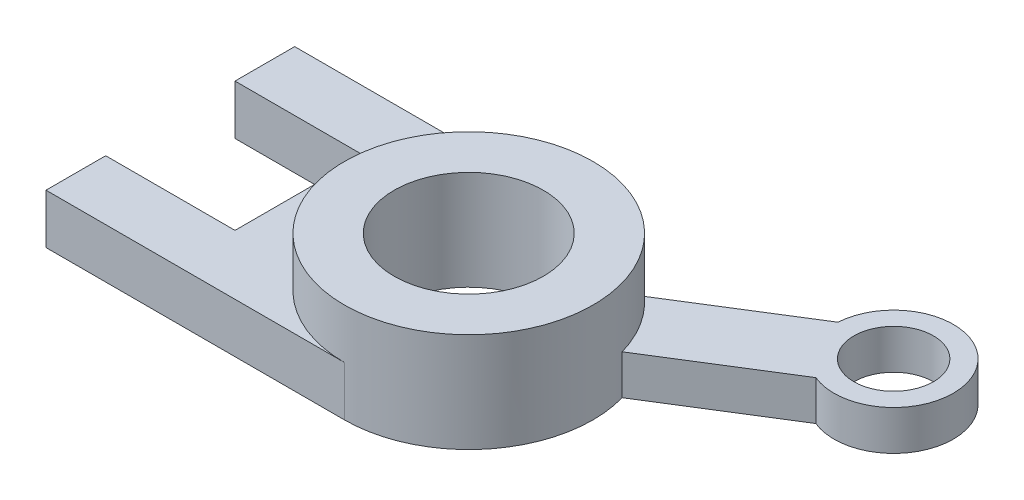
ISO-10303-21;
HEADER;
FILE_DESCRIPTION(('STEP AP214'),'2;1');
FILE_NAME('part.step','',(''),(''),'','','');
FILE_SCHEMA(('AUTOMOTIVE_DESIGN { 1 0 10303 214 1 1 1 1 }'));
ENDSEC;
DATA;
#1=APPLICATION_CONTEXT('core data for automotive mechanical design processes');
#2=APPLICATION_PROTOCOL_DEFINITION('international standard','automotive_design',2000,#1);
#3=PRODUCT_CONTEXT('',#1,'mechanical');
#4=PRODUCT('Part','Part','',(#3));
#5=PRODUCT_RELATED_PRODUCT_CATEGORY('part','',(#4));
#6=PRODUCT_DEFINITION_FORMATION('','',#4);
#7=PRODUCT_DEFINITION_CONTEXT('part definition',#1,'design');
#8=PRODUCT_DEFINITION('design','',#6,#7);
#9=PRODUCT_DEFINITION_SHAPE('','',#8);
#10=(LENGTH_UNIT() NAMED_UNIT(*) SI_UNIT(.MILLI.,.METRE.));
#11=(NAMED_UNIT(*) PLANE_ANGLE_UNIT() SI_UNIT($,.RADIAN.));
#12=(NAMED_UNIT(*) SI_UNIT($,.STERADIAN.) SOLID_ANGLE_UNIT());
#13=UNCERTAINTY_MEASURE_WITH_UNIT(LENGTH_MEASURE(1.E-05),#10,'distance_accuracy_value','');
#14=(GEOMETRIC_REPRESENTATION_CONTEXT(3) GLOBAL_UNCERTAINTY_ASSIGNED_CONTEXT((#13)) GLOBAL_UNIT_ASSIGNED_CONTEXT((#10,
#11,#12)) REPRESENTATION_CONTEXT('',''));
#15=CARTESIAN_POINT('',(0.,0.,0.));
#16=DIRECTION('',(0.,0.,1.));
#17=DIRECTION('',(1.,0.,0.));
#18=AXIS2_PLACEMENT_3D('',#15,#16,#17);
#19=CARTESIAN_POINT('',(0.,10.,0.));
#20=DIRECTION('',(0.,-1.,0.));
#21=DIRECTION('',(0.,0.,-1.));
#22=AXIS2_PLACEMENT_3D('',#19,#20,#21);
#23=CYLINDRICAL_SURFACE('',#22,12.5);
#24=CARTESIAN_POINT('',(0.,10.,0.));
#25=DIRECTION('',(0.,1.,0.));
#26=DIRECTION('',(0.,0.,1.));
#27=AXIS2_PLACEMENT_3D('',#24,#25,#26);
#28=CIRCLE('',#27,12.5);
#29=CARTESIAN_POINT('',(0.,10.,12.5));
#30=VERTEX_POINT('',#29);
#31=EDGE_CURVE('E11',#30,#30,#28,.T.);
#32=ORIENTED_EDGE('',*,*,#31,.F.);
#33=EDGE_LOOP('',(#32));
#34=FACE_BOUND('',#33,.T.);
#35=DIRECTION('',(0.,-1.,0.));
#36=VECTOR('',#35,1.);
#37=CARTESIAN_POINT('',(12.0312945786933,4.,-3.39086283425098));
#38=LINE('',#37,#36);
#39=CARTESIAN_POINT('',(12.0312945786933,4.,-3.39086283425098));
#40=VERTEX_POINT('',#39);
#41=CARTESIAN_POINT('',(12.0312945786933,0.,-3.39086283425098));
#42=VERTEX_POINT('',#41);
#43=EDGE_CURVE('E65',#40,#42,#38,.T.);
#44=ORIENTED_EDGE('',*,*,#43,.F.);
#45=CARTESIAN_POINT('',(0.,4.,0.));
#46=DIRECTION('',(0.,1.,0.));
#47=DIRECTION('',(0.,0.,1.));
#48=AXIS2_PLACEMENT_3D('',#45,#46,#47);
#49=CIRCLE('',#48,12.5);
#50=CARTESIAN_POINT('',(8.32185972906089,4.,-9.32719950734596));
#51=VERTEX_POINT('',#50);
#52=EDGE_CURVE('E60',#40,#51,#49,.T.);
#53=ORIENTED_EDGE('',*,*,#52,.T.);
#54=DIRECTION('',(0.,-1.,0.));
#55=VECTOR('',#54,1.);
#56=CARTESIAN_POINT('',(8.32185972906089,4.,-9.32719950734595));
#57=LINE('',#56,#55);
#58=CARTESIAN_POINT('',(8.32185972906089,0.,-9.32719950734595));
#59=VERTEX_POINT('',#58);
#60=EDGE_CURVE('E160',#51,#59,#57,.T.);
#61=ORIENTED_EDGE('',*,*,#60,.T.);
#62=CARTESIAN_POINT('',(0.,0.,0.));
#63=DIRECTION('',(0.,1.,0.));
#64=DIRECTION('',(0.,0.,1.));
#65=AXIS2_PLACEMENT_3D('',#62,#63,#64);
#66=CIRCLE('',#65,12.5);
#67=CARTESIAN_POINT('',(0.,0.,-12.5));
#68=VERTEX_POINT('',#67);
#69=EDGE_CURVE('E222',#59,#68,#66,.T.);
#70=ORIENTED_EDGE('',*,*,#69,.T.);
#71=DIRECTION('',(0.,-1.,0.));
#72=VECTOR('',#71,1.);
#73=CARTESIAN_POINT('',(0.,5.,-12.5));
#74=LINE('',#73,#72);
#75=CARTESIAN_POINT('',(0.,5.,-12.5));
#76=VERTEX_POINT('',#75);
#77=EDGE_CURVE('E216',#76,#68,#74,.T.);
#78=ORIENTED_EDGE('',*,*,#77,.F.);
#79=CARTESIAN_POINT('',(0.,5.,0.));
#80=DIRECTION('',(0.,1.,0.));
#81=DIRECTION('',(0.,0.,1.));
#82=AXIS2_PLACEMENT_3D('',#79,#80,#81);
#83=CIRCLE('',#82,12.5);
#84=CARTESIAN_POINT('',(0.,5.,12.5));
#85=VERTEX_POINT('',#84);
#86=EDGE_CURVE('E164',#76,#85,#83,.T.);
#87=ORIENTED_EDGE('',*,*,#86,.T.);
#88=DIRECTION('',(0.,-1.,0.));
#89=VECTOR('',#88,1.);
#90=CARTESIAN_POINT('',(0.,5.,12.5));
#91=LINE('',#90,#89);
#92=CARTESIAN_POINT('',(0.,0.,12.5));
#93=VERTEX_POINT('',#92);
#94=EDGE_CURVE('E183',#85,#93,#91,.T.);
#95=ORIENTED_EDGE('',*,*,#94,.T.);
#96=EDGE_CURVE('E47',#93,#42,#66,.T.);
#97=ORIENTED_EDGE('',*,*,#96,.T.);
#98=EDGE_LOOP('',(#44,#53,#61,#70,#78,#87,#95,#97));
#99=FACE_BOUND('',#98,.T.);
#100=ADVANCED_FACE('F43',(#34,#99),#23,.T.);
#101=CARTESIAN_POINT('',(0.,10.,0.));
#102=DIRECTION('',(0.,-1.,0.));
#103=DIRECTION('',(0.,0.,-1.));
#104=AXIS2_PLACEMENT_3D('',#101,#102,#103);
#105=CYLINDRICAL_SURFACE('',#104,7.5);
#106=CARTESIAN_POINT('',(0.,10.,0.));
#107=DIRECTION('',(0.,1.,0.));
#108=DIRECTION('',(0.,0.,1.));
#109=AXIS2_PLACEMENT_3D('',#106,#107,#108);
#110=CIRCLE('',#109,7.5);
#111=CARTESIAN_POINT('',(0.,10.,7.5));
#112=VERTEX_POINT('',#111);
#113=EDGE_CURVE('E52',#112,#112,#110,.T.);
#114=ORIENTED_EDGE('',*,*,#113,.T.);
#115=EDGE_LOOP('',(#114));
#116=FACE_BOUND('',#115,.T.);
#117=CARTESIAN_POINT('',(0.,0.,0.));
#118=DIRECTION('',(0.,1.,0.));
#119=DIRECTION('',(0.,0.,1.));
#120=AXIS2_PLACEMENT_3D('',#117,#118,#119);
#121=CIRCLE('',#120,7.5);
#122=CARTESIAN_POINT('',(0.,0.,7.5));
#123=VERTEX_POINT('',#122);
#124=EDGE_CURVE('E219',#123,#123,#121,.T.);
#125=ORIENTED_EDGE('',*,*,#124,.F.);
#126=EDGE_LOOP('',(#125));
#127=FACE_BOUND('',#126,.T.);
#128=ADVANCED_FACE('F45',(#116,#127),#105,.F.);
#129=CARTESIAN_POINT('',(0.,10.,0.));
#130=DIRECTION('',(0.,1.,0.));
#131=DIRECTION('',(0.,0.,1.));
#132=AXIS2_PLACEMENT_3D('',#129,#130,#131);
#133=PLANE('',#132);
#134=ORIENTED_EDGE('',*,*,#113,.F.);
#135=EDGE_LOOP('',(#134));
#136=FACE_BOUND('',#135,.T.);
#137=ORIENTED_EDGE('',*,*,#31,.T.);
#138=EDGE_LOOP('',(#137));
#139=FACE_BOUND('',#138,.T.);
#140=ADVANCED_FACE('F294',(#136,#139),#133,.T.);
#141=CARTESIAN_POINT('',(0.,0.,0.));
#142=DIRECTION('',(0.,1.,0.));
#143=DIRECTION('',(0.,0.,1.));
#144=AXIS2_PLACEMENT_3D('',#141,#142,#143);
#145=PLANE('',#144);
#146=ORIENTED_EDGE('',*,*,#124,.T.);
#147=EDGE_LOOP('',(#146));
#148=FACE_BOUND('',#147,.T.);
#149=ORIENTED_EDGE('',*,*,#96,.F.);
#150=DIRECTION('',(-1.,0.,0.));
#151=VECTOR('',#150,1.);
#152=CARTESIAN_POINT('',(0.,0.,12.5));
#153=LINE('',#152,#151);
#154=CARTESIAN_POINT('',(-30.,0.,12.5));
#155=VERTEX_POINT('',#154);
#156=EDGE_CURVE('E167',#93,#155,#153,.T.);
#157=ORIENTED_EDGE('',*,*,#156,.T.);
#158=DIRECTION('',(0.,0.,-1.));
#159=VECTOR('',#158,1.);
#160=CARTESIAN_POINT('',(-30.,0.,0.));
#161=LINE('',#160,#159);
#162=CARTESIAN_POINT('',(-30.,0.,6.50000000000001));
#163=VERTEX_POINT('',#162);
#164=EDGE_CURVE('E194',#155,#163,#161,.T.);
#165=ORIENTED_EDGE('',*,*,#164,.T.);
#166=DIRECTION('',(1.,0.,0.));
#167=VECTOR('',#166,1.);
#168=CARTESIAN_POINT('',(0.,0.,6.50000000000001));
#169=LINE('',#168,#167);
#170=CARTESIAN_POINT('',(-17.,0.,6.50000000000001));
#171=VERTEX_POINT('',#170);
#172=EDGE_CURVE('E191',#163,#171,#169,.T.);
#173=ORIENTED_EDGE('',*,*,#172,.T.);
#174=DIRECTION('',(0.,0.,1.));
#175=VECTOR('',#174,1.);
#176=CARTESIAN_POINT('',(-17.,0.,0.));
#177=LINE('',#176,#175);
#178=CARTESIAN_POINT('',(-17.,0.,-6.49999999999999));
#179=VERTEX_POINT('',#178);
#180=EDGE_CURVE('E188',#179,#171,#177,.T.);
#181=ORIENTED_EDGE('',*,*,#180,.F.);
#182=DIRECTION('',(1.,0.,0.));
#183=VECTOR('',#182,1.);
#184=CARTESIAN_POINT('',(0.,0.,-6.49999999999999));
#185=LINE('',#184,#183);
#186=CARTESIAN_POINT('',(-30.,0.,-6.49999999999999));
#187=VERTEX_POINT('',#186);
#188=EDGE_CURVE('E186',#187,#179,#185,.T.);
#189=ORIENTED_EDGE('',*,*,#188,.F.);
#190=DIRECTION('',(0.,0.,1.));
#191=VECTOR('',#190,1.);
#192=CARTESIAN_POINT('',(-30.,0.,0.));
#193=LINE('',#192,#191);
#194=CARTESIAN_POINT('',(-30.,0.,-12.5));
#195=VERTEX_POINT('',#194);
#196=EDGE_CURVE('E158',#195,#187,#193,.T.);
#197=ORIENTED_EDGE('',*,*,#196,.F.);
#198=DIRECTION('',(-1.,0.,0.));
#199=VECTOR('',#198,1.);
#200=CARTESIAN_POINT('',(0.,0.,-12.5));
#201=LINE('',#200,#199);
#202=EDGE_CURVE('E156',#68,#195,#201,.T.);
#203=ORIENTED_EDGE('',*,*,#202,.F.);
#204=ORIENTED_EDGE('',*,*,#69,.F.);
#205=DIRECTION('',(0.848048096156426,0.,-0.529919264233206));
#206=VECTOR('',#205,1.);
#207=CARTESIAN_POINT('',(-1.85471742481622,0.,-2.96816833654749));
#208=LINE('',#207,#206);
#209=CARTESIAN_POINT('',(20.3018983621612,0.,-16.8131584838601));
#210=VERTEX_POINT('',#209);
#211=EDGE_CURVE('E235',#59,#210,#208,.T.);
#212=ORIENTED_EDGE('',*,*,#211,.T.);
#213=CARTESIAN_POINT('',(26.2894909808492,0.,-16.4274971912294));
#214=DIRECTION('',(0.,1.,0.));
#215=DIRECTION('',(0.,0.,1.));
#216=AXIS2_PLACEMENT_3D('',#213,#214,#215);
#217=CIRCLE('',#216,6.);
#218=CARTESIAN_POINT('',(24.0113332117937,0.,-10.8768218107651));
#219=VERTEX_POINT('',#218);
#220=EDGE_CURVE('E233',#219,#210,#217,.T.);
#221=ORIENTED_EDGE('',*,*,#220,.F.);
#222=DIRECTION('',(0.848048096156426,0.,-0.529919264233206));
#223=VECTOR('',#222,1.);
#224=CARTESIAN_POINT('',(1.85471742481622,0.,2.96816833654749));
#225=LINE('',#224,#223);
#226=EDGE_CURVE('E155',#42,#219,#225,.T.);
#227=ORIENTED_EDGE('',*,*,#226,.F.);
#228=EDGE_LOOP('',(#149,#157,#165,#173,#181,#189,#197,#203,#204,#212,#221,#227));
#229=FACE_BOUND('',#228,.T.);
#230=CARTESIAN_POINT('',(26.2894909808492,0.,-16.4274971912294));
#231=DIRECTION('',(0.,1.,0.));
#232=DIRECTION('',(0.,0.,1.));
#233=AXIS2_PLACEMENT_3D('',#230,#231,#232);
#234=CIRCLE('',#233,4.00000000000001);
#235=CARTESIAN_POINT('',(26.2894909808492,0.,-12.4274971912294));
#236=VERTEX_POINT('',#235);
#237=EDGE_CURVE('E151',#236,#236,#234,.T.);
#238=ORIENTED_EDGE('',*,*,#237,.T.);
#239=EDGE_LOOP('',(#238));
#240=FACE_BOUND('',#239,.T.);
#241=ADVANCED_FACE('F230',(#148,#229,#240),#145,.F.);
#242=CARTESIAN_POINT('',(0.,5.,-12.5));
#243=DIRECTION('',(0.,0.,1.));
#244=DIRECTION('',(1.,0.,0.));
#245=AXIS2_PLACEMENT_3D('',#242,#243,#244);
#246=PLANE('',#245);
#247=ORIENTED_EDGE('',*,*,#202,.T.);
#248=DIRECTION('',(0.,-1.,0.));
#249=VECTOR('',#248,1.);
#250=CARTESIAN_POINT('',(-30.,5.,-12.5));
#251=LINE('',#250,#249);
#252=CARTESIAN_POINT('',(-30.,5.,-12.5));
#253=VERTEX_POINT('',#252);
#254=EDGE_CURVE('E213',#253,#195,#251,.T.);
#255=ORIENTED_EDGE('',*,*,#254,.F.);
#256=DIRECTION('',(-1.,0.,0.));
#257=VECTOR('',#256,1.);
#258=CARTESIAN_POINT('',(0.,5.,-12.5));
#259=LINE('',#258,#257);
#260=EDGE_CURVE('E166',#76,#253,#259,.T.);
#261=ORIENTED_EDGE('',*,*,#260,.F.);
#262=ORIENTED_EDGE('',*,*,#77,.T.);
#263=EDGE_LOOP('',(#247,#255,#261,#262));
#264=FACE_BOUND('',#263,.T.);
#265=ADVANCED_FACE('F250',(#264),#246,.F.);
#266=CARTESIAN_POINT('',(-30.,5.,0.));
#267=DIRECTION('',(1.,0.,0.));
#268=DIRECTION('',(0.,0.,-1.));
#269=AXIS2_PLACEMENT_3D('',#266,#267,#268);
#270=PLANE('',#269);
#271=ORIENTED_EDGE('',*,*,#196,.T.);
#272=DIRECTION('',(0.,-1.,0.));
#273=VECTOR('',#272,1.);
#274=CARTESIAN_POINT('',(-30.,5.,-6.49999999999999));
#275=LINE('',#274,#273);
#276=CARTESIAN_POINT('',(-30.,5.,-6.49999999999999));
#277=VERTEX_POINT('',#276);
#278=EDGE_CURVE('E210',#277,#187,#275,.T.);
#279=ORIENTED_EDGE('',*,*,#278,.F.);
#280=DIRECTION('',(0.,0.,1.));
#281=VECTOR('',#280,1.);
#282=CARTESIAN_POINT('',(-30.,5.,0.));
#283=LINE('',#282,#281);
#284=EDGE_CURVE('E169',#253,#277,#283,.T.);
#285=ORIENTED_EDGE('',*,*,#284,.F.);
#286=ORIENTED_EDGE('',*,*,#254,.T.);
#287=EDGE_LOOP('',(#271,#279,#285,#286));
#288=FACE_BOUND('',#287,.T.);
#289=ADVANCED_FACE('F254',(#288),#270,.F.);
#290=CARTESIAN_POINT('',(0.,5.,-6.49999999999999));
#291=DIRECTION('',(0.,0.,-1.));
#292=DIRECTION('',(-1.,0.,0.));
#293=AXIS2_PLACEMENT_3D('',#290,#291,#292);
#294=PLANE('',#293);
#295=ORIENTED_EDGE('',*,*,#188,.T.);
#296=DIRECTION('',(0.,-1.,0.));
#297=VECTOR('',#296,1.);
#298=CARTESIAN_POINT('',(-17.,5.,-6.49999999999999));
#299=LINE('',#298,#297);
#300=CARTESIAN_POINT('',(-17.,5.,-6.49999999999999));
#301=VERTEX_POINT('',#300);
#302=EDGE_CURVE('E207',#301,#179,#299,.T.);
#303=ORIENTED_EDGE('',*,*,#302,.F.);
#304=DIRECTION('',(1.,0.,0.));
#305=VECTOR('',#304,1.);
#306=CARTESIAN_POINT('',(0.,5.,-6.49999999999999));
#307=LINE('',#306,#305);
#308=EDGE_CURVE('E171',#277,#301,#307,.T.);
#309=ORIENTED_EDGE('',*,*,#308,.F.);
#310=ORIENTED_EDGE('',*,*,#278,.T.);
#311=EDGE_LOOP('',(#295,#303,#309,#310));
#312=FACE_BOUND('',#311,.T.);
#313=ADVANCED_FACE('F278',(#312),#294,.F.);
#314=CARTESIAN_POINT('',(-17.,5.,0.));
#315=DIRECTION('',(1.,0.,0.));
#316=DIRECTION('',(0.,0.,-1.));
#317=AXIS2_PLACEMENT_3D('',#314,#315,#316);
#318=PLANE('',#317);
#319=ORIENTED_EDGE('',*,*,#180,.T.);
#320=DIRECTION('',(0.,-1.,0.));
#321=VECTOR('',#320,1.);
#322=CARTESIAN_POINT('',(-17.,5.,6.50000000000001));
#323=LINE('',#322,#321);
#324=CARTESIAN_POINT('',(-17.,5.,6.50000000000001));
#325=VERTEX_POINT('',#324);
#326=EDGE_CURVE('E205',#325,#171,#323,.T.);
#327=ORIENTED_EDGE('',*,*,#326,.F.);
#328=DIRECTION('',(0.,0.,1.));
#329=VECTOR('',#328,1.);
#330=CARTESIAN_POINT('',(-17.,5.,0.));
#331=LINE('',#330,#329);
#332=EDGE_CURVE('E173',#301,#325,#331,.T.);
#333=ORIENTED_EDGE('',*,*,#332,.F.);
#334=ORIENTED_EDGE('',*,*,#302,.T.);
#335=EDGE_LOOP('',(#319,#327,#333,#334));
#336=FACE_BOUND('',#335,.T.);
#337=ADVANCED_FACE('F276',(#336),#318,.F.);
#338=CARTESIAN_POINT('',(0.,5.,6.50000000000001));
#339=DIRECTION('',(0.,0.,-1.));
#340=DIRECTION('',(-1.,0.,0.));
#341=AXIS2_PLACEMENT_3D('',#338,#339,#340);
#342=PLANE('',#341);
#343=ORIENTED_EDGE('',*,*,#172,.F.);
#344=DIRECTION('',(0.,-1.,0.));
#345=VECTOR('',#344,1.);
#346=CARTESIAN_POINT('',(-30.,5.,6.50000000000001));
#347=LINE('',#346,#345);
#348=CARTESIAN_POINT('',(-30.,5.,6.50000000000001));
#349=VERTEX_POINT('',#348);
#350=EDGE_CURVE('E203',#349,#163,#347,.T.);
#351=ORIENTED_EDGE('',*,*,#350,.F.);
#352=DIRECTION('',(1.,0.,0.));
#353=VECTOR('',#352,1.);
#354=CARTESIAN_POINT('',(0.,5.,6.50000000000001));
#355=LINE('',#354,#353);
#356=EDGE_CURVE('E175',#349,#325,#355,.T.);
#357=ORIENTED_EDGE('',*,*,#356,.T.);
#358=ORIENTED_EDGE('',*,*,#326,.T.);
#359=EDGE_LOOP('',(#343,#351,#357,#358));
#360=FACE_BOUND('',#359,.T.);
#361=ADVANCED_FACE('F272',(#360),#342,.T.);
#362=CARTESIAN_POINT('',(-30.,5.,0.));
#363=DIRECTION('',(-1.,0.,0.));
#364=DIRECTION('',(0.,0.,1.));
#365=AXIS2_PLACEMENT_3D('',#362,#363,#364);
#366=PLANE('',#365);
#367=ORIENTED_EDGE('',*,*,#164,.F.);
#368=DIRECTION('',(0.,-1.,0.));
#369=VECTOR('',#368,1.);
#370=CARTESIAN_POINT('',(-30.,5.,12.5));
#371=LINE('',#370,#369);
#372=CARTESIAN_POINT('',(-30.,5.,12.5));
#373=VERTEX_POINT('',#372);
#374=EDGE_CURVE('E201',#373,#155,#371,.T.);
#375=ORIENTED_EDGE('',*,*,#374,.F.);
#376=DIRECTION('',(0.,0.,-1.));
#377=VECTOR('',#376,1.);
#378=CARTESIAN_POINT('',(-30.,5.,0.));
#379=LINE('',#378,#377);
#380=EDGE_CURVE('E178',#373,#349,#379,.T.);
#381=ORIENTED_EDGE('',*,*,#380,.T.);
#382=ORIENTED_EDGE('',*,*,#350,.T.);
#383=EDGE_LOOP('',(#367,#375,#381,#382));
#384=FACE_BOUND('',#383,.T.);
#385=ADVANCED_FACE('F269',(#384),#366,.T.);
#386=CARTESIAN_POINT('',(0.,5.,12.5));
#387=DIRECTION('',(0.,0.,1.));
#388=DIRECTION('',(1.,0.,0.));
#389=AXIS2_PLACEMENT_3D('',#386,#387,#388);
#390=PLANE('',#389);
#391=ORIENTED_EDGE('',*,*,#156,.F.);
#392=ORIENTED_EDGE('',*,*,#94,.F.);
#393=DIRECTION('',(-1.,0.,0.));
#394=VECTOR('',#393,1.);
#395=CARTESIAN_POINT('',(0.,5.,12.5));
#396=LINE('',#395,#394);
#397=EDGE_CURVE('E181',#85,#373,#396,.T.);
#398=ORIENTED_EDGE('',*,*,#397,.T.);
#399=ORIENTED_EDGE('',*,*,#374,.T.);
#400=EDGE_LOOP('',(#391,#392,#398,#399));
#401=FACE_BOUND('',#400,.T.);
#402=ADVANCED_FACE('F264',(#401),#390,.T.);
#403=CARTESIAN_POINT('',(0.,5.,0.));
#404=DIRECTION('',(0.,1.,0.));
#405=DIRECTION('',(0.,0.,1.));
#406=AXIS2_PLACEMENT_3D('',#403,#404,#405);
#407=PLANE('',#406);
#408=ORIENTED_EDGE('',*,*,#86,.F.);
#409=ORIENTED_EDGE('',*,*,#260,.T.);
#410=ORIENTED_EDGE('',*,*,#284,.T.);
#411=ORIENTED_EDGE('',*,*,#308,.T.);
#412=ORIENTED_EDGE('',*,*,#332,.T.);
#413=ORIENTED_EDGE('',*,*,#356,.F.);
#414=ORIENTED_EDGE('',*,*,#380,.F.);
#415=ORIENTED_EDGE('',*,*,#397,.F.);
#416=EDGE_LOOP('',(#408,#409,#410,#411,#412,#413,#414,#415));
#417=FACE_BOUND('',#416,.T.);
#418=ADVANCED_FACE('F259',(#417),#407,.T.);
#419=CARTESIAN_POINT('',(1.85471742481622,4.,2.96816833654749));
#420=DIRECTION('',(-0.529919264233206,0.,-0.848048096156426));
#421=DIRECTION('',(-0.848048096156426,0.,0.529919264233206));
#422=AXIS2_PLACEMENT_3D('',#419,#420,#421);
#423=PLANE('',#422);
#424=ORIENTED_EDGE('',*,*,#226,.T.);
#425=DIRECTION('',(0.,-1.,0.));
#426=VECTOR('',#425,1.);
#427=CARTESIAN_POINT('',(24.0113332117937,4.,-10.8768218107651));
#428=LINE('',#427,#426);
#429=CARTESIAN_POINT('',(24.0113332117937,4.,-10.8768218107651));
#430=VERTEX_POINT('',#429);
#431=EDGE_CURVE('E139',#430,#219,#428,.T.);
#432=ORIENTED_EDGE('',*,*,#431,.F.);
#433=DIRECTION('',(0.848048096156426,0.,-0.529919264233206));
#434=VECTOR('',#433,1.);
#435=CARTESIAN_POINT('',(1.85471742481622,4.,2.96816833654749));
#436=LINE('',#435,#434);
#437=EDGE_CURVE('E146',#40,#430,#436,.T.);
#438=ORIENTED_EDGE('',*,*,#437,.F.);
#439=ORIENTED_EDGE('',*,*,#43,.T.);
#440=EDGE_LOOP('',(#424,#432,#438,#439));
#441=FACE_BOUND('',#440,.T.);
#442=ADVANCED_FACE('F153',(#441),#423,.F.);
#443=CARTESIAN_POINT('',(26.2894909808492,4.,-16.4274971912294));
#444=DIRECTION('',(0.,-1.,0.));
#445=DIRECTION('',(0.,0.,-1.));
#446=AXIS2_PLACEMENT_3D('',#443,#444,#445);
#447=CYLINDRICAL_SURFACE('',#446,6.);
#448=ORIENTED_EDGE('',*,*,#220,.T.);
#449=DIRECTION('',(0.,-1.,0.));
#450=VECTOR('',#449,1.);
#451=CARTESIAN_POINT('',(20.3018983621612,4.,-16.8131584838601));
#452=LINE('',#451,#450);
#453=CARTESIAN_POINT('',(20.3018983621612,4.,-16.8131584838601));
#454=VERTEX_POINT('',#453);
#455=EDGE_CURVE('E141',#454,#210,#452,.T.);
#456=ORIENTED_EDGE('',*,*,#455,.F.);
#457=CARTESIAN_POINT('',(26.2894909808492,4.,-16.4274971912294));
#458=DIRECTION('',(0.,1.,0.));
#459=DIRECTION('',(0.,0.,1.));
#460=AXIS2_PLACEMENT_3D('',#457,#458,#459);
#461=CIRCLE('',#460,6.);
#462=EDGE_CURVE('E134',#430,#454,#461,.T.);
#463=ORIENTED_EDGE('',*,*,#462,.F.);
#464=ORIENTED_EDGE('',*,*,#431,.T.);
#465=EDGE_LOOP('',(#448,#456,#463,#464));
#466=FACE_BOUND('',#465,.T.);
#467=ADVANCED_FACE('F137',(#466),#447,.T.);
#468=CARTESIAN_POINT('',(-1.85471742481622,4.,-2.96816833654749));
#469=DIRECTION('',(-0.529919264233206,0.,-0.848048096156426));
#470=DIRECTION('',(-0.848048096156426,0.,0.529919264233206));
#471=AXIS2_PLACEMENT_3D('',#468,#469,#470);
#472=PLANE('',#471);
#473=ORIENTED_EDGE('',*,*,#211,.F.);
#474=ORIENTED_EDGE('',*,*,#60,.F.);
#475=DIRECTION('',(0.848048096156426,0.,-0.529919264233206));
#476=VECTOR('',#475,1.);
#477=CARTESIAN_POINT('',(-1.85471742481622,4.,-2.96816833654749));
#478=LINE('',#477,#476);
#479=EDGE_CURVE('E145',#51,#454,#478,.T.);
#480=ORIENTED_EDGE('',*,*,#479,.T.);
#481=ORIENTED_EDGE('',*,*,#455,.T.);
#482=EDGE_LOOP('',(#473,#474,#480,#481));
#483=FACE_BOUND('',#482,.T.);
#484=ADVANCED_FACE('F244',(#483),#472,.T.);
#485=CARTESIAN_POINT('',(26.2894909808492,4.,-16.4274971912294));
#486=DIRECTION('',(0.,-1.,0.));
#487=DIRECTION('',(0.,0.,-1.));
#488=AXIS2_PLACEMENT_3D('',#485,#486,#487);
#489=CYLINDRICAL_SURFACE('',#488,4.00000000000001);
#490=CARTESIAN_POINT('',(26.2894909808492,4.,-16.4274971912294));
#491=DIRECTION('',(0.,1.,0.));
#492=DIRECTION('',(0.,0.,1.));
#493=AXIS2_PLACEMENT_3D('',#490,#491,#492);
#494=CIRCLE('',#493,4.00000000000001);
#495=CARTESIAN_POINT('',(26.2894909808492,4.,-12.4274971912294));
#496=VERTEX_POINT('',#495);
#497=EDGE_CURVE('E228',#496,#496,#494,.T.);
#498=ORIENTED_EDGE('',*,*,#497,.T.);
#499=EDGE_LOOP('',(#498));
#500=FACE_BOUND('',#499,.T.);
#501=ORIENTED_EDGE('',*,*,#237,.F.);
#502=EDGE_LOOP('',(#501));
#503=FACE_BOUND('',#502,.T.);
#504=ADVANCED_FACE('F394',(#500,#503),#489,.F.);
#505=CARTESIAN_POINT('',(0.,4.,0.));
#506=DIRECTION('',(0.,1.,0.));
#507=DIRECTION('',(0.,0.,1.));
#508=AXIS2_PLACEMENT_3D('',#505,#506,#507);
#509=PLANE('',#508);
#510=ORIENTED_EDGE('',*,*,#437,.T.);
#511=ORIENTED_EDGE('',*,*,#462,.T.);
#512=ORIENTED_EDGE('',*,*,#479,.F.);
#513=ORIENTED_EDGE('',*,*,#52,.F.);
#514=EDGE_LOOP('',(#510,#511,#512,#513));
#515=FACE_BOUND('',#514,.T.);
#516=ORIENTED_EDGE('',*,*,#497,.F.);
#517=EDGE_LOOP('',(#516));
#518=FACE_BOUND('',#517,.T.);
#519=ADVANCED_FACE('F148',(#515,#518),#509,.T.);
#520=CLOSED_SHELL('',(#100,#128,#140,#241,#265,#289,#313,#337,#361,#385,#402,#418,#442,#467,
#484,#504,#519));
#521=MANIFOLD_SOLID_BREP('B2',#520);
#522=ADVANCED_BREP_SHAPE_REPRESENTATION('',(#18,#521),#14);
#523=SHAPE_DEFINITION_REPRESENTATION(#9,#522);
ENDSEC;
END-ISO-10303-21;
